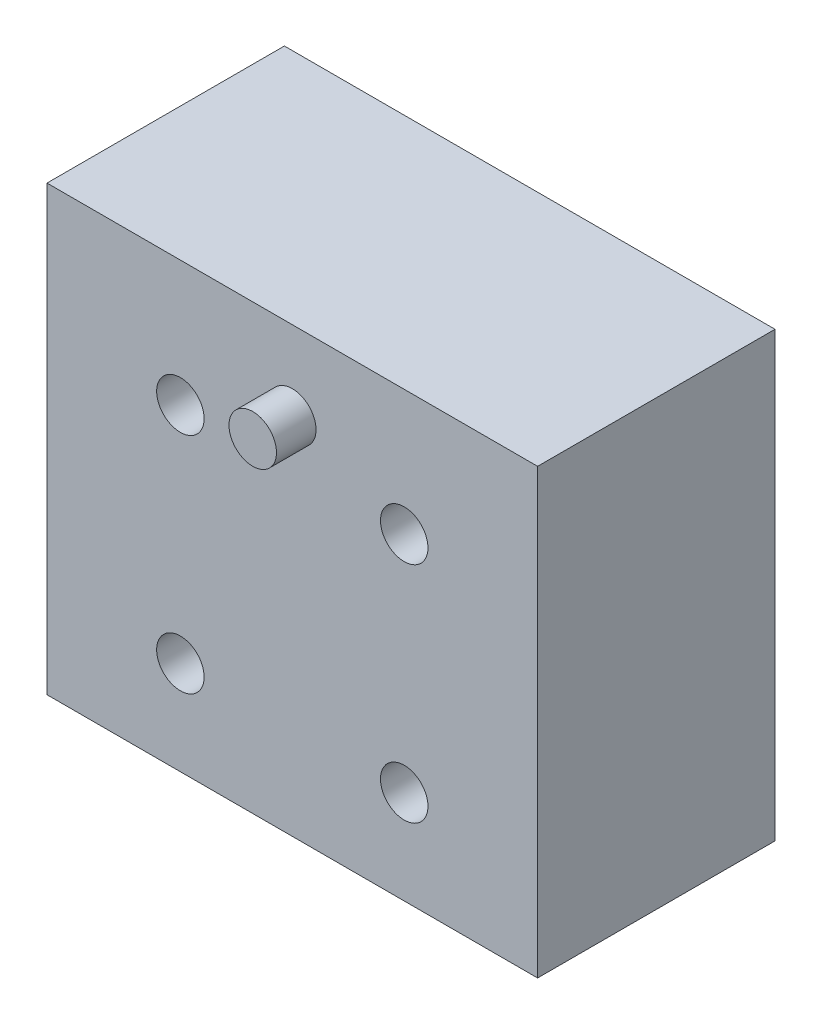
ISO-10303-21;
HEADER;
FILE_DESCRIPTION(('STEP AP214'),'2;1');
FILE_NAME('part.step','',(''),(''),'','','');
FILE_SCHEMA(('AUTOMOTIVE_DESIGN { 1 0 10303 214 1 1 1 1 }'));
ENDSEC;
DATA;
#1=APPLICATION_CONTEXT('core data for automotive mechanical design processes');
#2=APPLICATION_PROTOCOL_DEFINITION('international standard','automotive_design',2000,#1);
#3=PRODUCT_CONTEXT('',#1,'mechanical');
#4=PRODUCT('Part','Part','',(#3));
#5=PRODUCT_RELATED_PRODUCT_CATEGORY('part','',(#4));
#6=PRODUCT_DEFINITION_FORMATION('','',#4);
#7=PRODUCT_DEFINITION_CONTEXT('part definition',#1,'design');
#8=PRODUCT_DEFINITION('design','',#6,#7);
#9=PRODUCT_DEFINITION_SHAPE('','',#8);
#10=(LENGTH_UNIT() NAMED_UNIT(*) SI_UNIT(.MILLI.,.METRE.));
#11=(NAMED_UNIT(*) PLANE_ANGLE_UNIT() SI_UNIT($,.RADIAN.));
#12=(NAMED_UNIT(*) SI_UNIT($,.STERADIAN.) SOLID_ANGLE_UNIT());
#13=UNCERTAINTY_MEASURE_WITH_UNIT(LENGTH_MEASURE(1.E-05),#10,'distance_accuracy_value','');
#14=(GEOMETRIC_REPRESENTATION_CONTEXT(3) GLOBAL_UNCERTAINTY_ASSIGNED_CONTEXT((#13)) GLOBAL_UNIT_ASSIGNED_CONTEXT((#10,
#11,#12)) REPRESENTATION_CONTEXT('',''));
#15=CARTESIAN_POINT('',(0.,0.,0.));
#16=DIRECTION('',(0.,0.,1.));
#17=DIRECTION('',(1.,0.,0.));
#18=AXIS2_PLACEMENT_3D('',#15,#16,#17);
#19=CARTESIAN_POINT('',(-14.142135623731,14.1421356237309,-30.));
#20=DIRECTION('',(0.,0.,1.));
#21=DIRECTION('',(1.,0.,0.));
#22=AXIS2_PLACEMENT_3D('',#19,#20,#21);
#23=CYLINDRICAL_SURFACE('',#22,3.);
#24=CARTESIAN_POINT('',(-14.142135623731,14.1421356237309,0.));
#25=DIRECTION('',(0.,0.,1.));
#26=DIRECTION('',(1.,0.,0.));
#27=AXIS2_PLACEMENT_3D('',#24,#25,#26);
#28=CIRCLE('',#27,3.);
#29=CARTESIAN_POINT('',(-11.142135623731,14.1421356237309,0.));
#30=VERTEX_POINT('',#29);
#31=EDGE_CURVE('E11',#30,#30,#28,.T.);
#32=ORIENTED_EDGE('',*,*,#31,.T.);
#33=EDGE_LOOP('',(#32));
#34=FACE_BOUND('',#33,.T.);
#35=CARTESIAN_POINT('',(-14.142135623731,14.1421356237309,-24.));
#36=DIRECTION('',(0.,0.,-1.));
#37=DIRECTION('',(-1.,0.,0.));
#38=AXIS2_PLACEMENT_3D('',#35,#36,#37);
#39=CIRCLE('',#38,3.);
#40=CARTESIAN_POINT('',(-17.142135623731,14.1421356237309,-24.));
#41=VERTEX_POINT('',#40);
#42=EDGE_CURVE('E41',#41,#41,#39,.F.);
#43=ORIENTED_EDGE('',*,*,#42,.F.);
#44=EDGE_LOOP('',(#43));
#45=FACE_BOUND('',#44,.T.);
#46=ADVANCED_FACE('F37',(#34,#45),#23,.F.);
#47=CARTESIAN_POINT('',(-14.142135623731,-14.1421356237309,-30.));
#48=DIRECTION('',(0.,0.,1.));
#49=DIRECTION('',(1.,0.,0.));
#50=AXIS2_PLACEMENT_3D('',#47,#48,#49);
#51=CYLINDRICAL_SURFACE('',#50,3.);
#52=CARTESIAN_POINT('',(-14.142135623731,-14.1421356237309,0.));
#53=DIRECTION('',(0.,0.,1.));
#54=DIRECTION('',(1.,0.,0.));
#55=AXIS2_PLACEMENT_3D('',#52,#53,#54);
#56=CIRCLE('',#55,3.);
#57=CARTESIAN_POINT('',(-11.142135623731,-14.1421356237309,0.));
#58=VERTEX_POINT('',#57);
#59=EDGE_CURVE('E46',#58,#58,#56,.T.);
#60=ORIENTED_EDGE('',*,*,#59,.T.);
#61=EDGE_LOOP('',(#60));
#62=FACE_BOUND('',#61,.T.);
#63=CARTESIAN_POINT('',(-14.142135623731,-14.1421356237309,-24.));
#64=DIRECTION('',(0.,0.,-1.));
#65=DIRECTION('',(-1.,0.,0.));
#66=AXIS2_PLACEMENT_3D('',#63,#64,#65);
#67=CIRCLE('',#66,3.);
#68=CARTESIAN_POINT('',(-17.142135623731,-14.1421356237309,-24.));
#69=VERTEX_POINT('',#68);
#70=EDGE_CURVE('E113',#69,#69,#67,.F.);
#71=ORIENTED_EDGE('',*,*,#70,.F.);
#72=EDGE_LOOP('',(#71));
#73=FACE_BOUND('',#72,.T.);
#74=ADVANCED_FACE('F206',(#62,#73),#51,.F.);
#75=CARTESIAN_POINT('',(14.142135623731,-14.1421356237309,-30.));
#76=DIRECTION('',(0.,0.,1.));
#77=DIRECTION('',(1.,0.,0.));
#78=AXIS2_PLACEMENT_3D('',#75,#76,#77);
#79=CYLINDRICAL_SURFACE('',#78,3.);
#80=CARTESIAN_POINT('',(14.142135623731,-14.1421356237309,0.));
#81=DIRECTION('',(0.,0.,1.));
#82=DIRECTION('',(1.,0.,0.));
#83=AXIS2_PLACEMENT_3D('',#80,#81,#82);
#84=CIRCLE('',#83,3.);
#85=CARTESIAN_POINT('',(17.142135623731,-14.1421356237309,0.));
#86=VERTEX_POINT('',#85);
#87=EDGE_CURVE('E97',#86,#86,#84,.T.);
#88=ORIENTED_EDGE('',*,*,#87,.T.);
#89=EDGE_LOOP('',(#88));
#90=FACE_BOUND('',#89,.T.);
#91=CARTESIAN_POINT('',(14.142135623731,-14.1421356237309,-24.));
#92=DIRECTION('',(0.,0.,-1.));
#93=DIRECTION('',(-1.,0.,0.));
#94=AXIS2_PLACEMENT_3D('',#91,#92,#93);
#95=CIRCLE('',#94,3.);
#96=CARTESIAN_POINT('',(11.142135623731,-14.1421356237309,-24.));
#97=VERTEX_POINT('',#96);
#98=EDGE_CURVE('E110',#97,#97,#95,.F.);
#99=ORIENTED_EDGE('',*,*,#98,.F.);
#100=EDGE_LOOP('',(#99));
#101=FACE_BOUND('',#100,.T.);
#102=ADVANCED_FACE('F184',(#90,#101),#79,.F.);
#103=CARTESIAN_POINT('',(14.142135623731,14.1421356237309,-30.));
#104=DIRECTION('',(0.,0.,1.));
#105=DIRECTION('',(1.,0.,0.));
#106=AXIS2_PLACEMENT_3D('',#103,#104,#105);
#107=CYLINDRICAL_SURFACE('',#106,3.);
#108=CARTESIAN_POINT('',(14.142135623731,14.1421356237309,0.));
#109=DIRECTION('',(0.,0.,1.));
#110=DIRECTION('',(1.,0.,0.));
#111=AXIS2_PLACEMENT_3D('',#108,#109,#110);
#112=CIRCLE('',#111,3.);
#113=CARTESIAN_POINT('',(17.142135623731,14.1421356237309,0.));
#114=VERTEX_POINT('',#113);
#115=EDGE_CURVE('E94',#114,#114,#112,.T.);
#116=ORIENTED_EDGE('',*,*,#115,.T.);
#117=EDGE_LOOP('',(#116));
#118=FACE_BOUND('',#117,.T.);
#119=CARTESIAN_POINT('',(14.142135623731,14.1421356237309,-24.));
#120=DIRECTION('',(0.,0.,-1.));
#121=DIRECTION('',(-1.,0.,0.));
#122=AXIS2_PLACEMENT_3D('',#119,#120,#121);
#123=CIRCLE('',#122,3.);
#124=CARTESIAN_POINT('',(11.142135623731,14.1421356237309,-24.));
#125=VERTEX_POINT('',#124);
#126=EDGE_CURVE('E107',#125,#125,#123,.F.);
#127=ORIENTED_EDGE('',*,*,#126,.F.);
#128=EDGE_LOOP('',(#127));
#129=FACE_BOUND('',#128,.T.);
#130=ADVANCED_FACE('F39',(#118,#129),#107,.F.);
#131=CARTESIAN_POINT('',(0.,0.,-30.));
#132=DIRECTION('',(0.,0.,1.));
#133=DIRECTION('',(1.,0.,0.));
#134=AXIS2_PLACEMENT_3D('',#131,#132,#133);
#135=PLANE('',#134);
#136=CARTESIAN_POINT('',(14.142135623731,14.1421356237309,-30.));
#137=DIRECTION('',(0.,0.,-1.));
#138=DIRECTION('',(-1.,0.,0.));
#139=AXIS2_PLACEMENT_3D('',#136,#137,#138);
#140=CIRCLE('',#139,4.75);
#141=CARTESIAN_POINT('',(9.39213562373097,14.1421356237309,-30.));
#142=VERTEX_POINT('',#141);
#143=EDGE_CURVE('E265',#142,#142,#140,.T.);
#144=ORIENTED_EDGE('',*,*,#143,.F.);
#145=EDGE_LOOP('',(#144));
#146=FACE_BOUND('',#145,.T.);
#147=CARTESIAN_POINT('',(14.142135623731,-14.1421356237309,-30.));
#148=DIRECTION('',(0.,0.,-1.));
#149=DIRECTION('',(-1.,0.,0.));
#150=AXIS2_PLACEMENT_3D('',#147,#148,#149);
#151=CIRCLE('',#150,4.75);
#152=CARTESIAN_POINT('',(9.39213562373098,-14.1421356237309,-30.));
#153=VERTEX_POINT('',#152);
#154=EDGE_CURVE('E258',#153,#153,#151,.T.);
#155=ORIENTED_EDGE('',*,*,#154,.F.);
#156=EDGE_LOOP('',(#155));
#157=FACE_BOUND('',#156,.T.);
#158=CARTESIAN_POINT('',(-14.142135623731,-14.1421356237309,-30.));
#159=DIRECTION('',(0.,0.,-1.));
#160=DIRECTION('',(-1.,0.,0.));
#161=AXIS2_PLACEMENT_3D('',#158,#159,#160);
#162=CIRCLE('',#161,4.75);
#163=CARTESIAN_POINT('',(-18.892135623731,-14.1421356237309,-30.));
#164=VERTEX_POINT('',#163);
#165=EDGE_CURVE('E253',#164,#164,#162,.T.);
#166=ORIENTED_EDGE('',*,*,#165,.F.);
#167=EDGE_LOOP('',(#166));
#168=FACE_BOUND('',#167,.T.);
#169=CARTESIAN_POINT('',(-14.142135623731,14.1421356237309,-30.));
#170=DIRECTION('',(0.,0.,-1.));
#171=DIRECTION('',(-1.,0.,0.));
#172=AXIS2_PLACEMENT_3D('',#169,#170,#171);
#173=CIRCLE('',#172,4.75);
#174=CARTESIAN_POINT('',(-18.892135623731,14.1421356237309,-30.));
#175=VERTEX_POINT('',#174);
#176=EDGE_CURVE('E255',#175,#175,#173,.T.);
#177=ORIENTED_EDGE('',*,*,#176,.F.);
#178=EDGE_LOOP('',(#177));
#179=FACE_BOUND('',#178,.T.);
#180=DIRECTION('',(0.,-1.,0.));
#181=VECTOR('',#180,1.);
#182=CARTESIAN_POINT('',(31.,0.,-30.));
#183=LINE('',#182,#181);
#184=CARTESIAN_POINT('',(31.,30.,-30.));
#185=VERTEX_POINT('',#184);
#186=CARTESIAN_POINT('',(31.,-26.,-30.));
#187=VERTEX_POINT('',#186);
#188=EDGE_CURVE('E82',#185,#187,#183,.T.);
#189=ORIENTED_EDGE('',*,*,#188,.T.);
#190=DIRECTION('',(-1.,0.,0.));
#191=VECTOR('',#190,1.);
#192=CARTESIAN_POINT('',(-31.,-26.,-30.));
#193=LINE('',#192,#191);
#194=CARTESIAN_POINT('',(-31.,-26.,-30.));
#195=VERTEX_POINT('',#194);
#196=EDGE_CURVE('E54',#187,#195,#193,.T.);
#197=ORIENTED_EDGE('',*,*,#196,.T.);
#198=DIRECTION('',(0.,1.,0.));
#199=VECTOR('',#198,1.);
#200=CARTESIAN_POINT('',(-31.,0.,-30.));
#201=LINE('',#200,#199);
#202=CARTESIAN_POINT('',(-31.,30.,-30.));
#203=VERTEX_POINT('',#202);
#204=EDGE_CURVE('E77',#195,#203,#201,.T.);
#205=ORIENTED_EDGE('',*,*,#204,.T.);
#206=DIRECTION('',(1.,0.,0.));
#207=VECTOR('',#206,1.);
#208=CARTESIAN_POINT('',(0.,30.,-30.));
#209=LINE('',#208,#207);
#210=EDGE_CURVE('E81',#203,#185,#209,.T.);
#211=ORIENTED_EDGE('',*,*,#210,.T.);
#212=EDGE_LOOP('',(#189,#197,#205,#211));
#213=FACE_BOUND('',#212,.T.);
#214=ADVANCED_FACE('F80',(#146,#157,#168,#179,#213),#135,.F.);
#215=CARTESIAN_POINT('',(0.,0.,0.));
#216=DIRECTION('',(0.,0.,1.));
#217=DIRECTION('',(1.,0.,0.));
#218=AXIS2_PLACEMENT_3D('',#215,#216,#217);
#219=PLANE('',#218);
#220=CARTESIAN_POINT('',(0.,20.,0.));
#221=DIRECTION('',(0.,0.,1.));
#222=DIRECTION('',(1.,0.,0.));
#223=AXIS2_PLACEMENT_3D('',#220,#221,#222);
#224=CIRCLE('',#223,3.);
#225=CARTESIAN_POINT('',(3.,20.,0.));
#226=VERTEX_POINT('',#225);
#227=EDGE_CURVE('E118',#226,#226,#224,.T.);
#228=ORIENTED_EDGE('',*,*,#227,.F.);
#229=EDGE_LOOP('',(#228));
#230=FACE_BOUND('',#229,.T.);
#231=DIRECTION('',(-1.,0.,0.));
#232=VECTOR('',#231,1.);
#233=CARTESIAN_POINT('',(-31.,-26.,0.));
#234=LINE('',#233,#232);
#235=CARTESIAN_POINT('',(31.,-26.,0.));
#236=VERTEX_POINT('',#235);
#237=CARTESIAN_POINT('',(-31.,-26.,0.));
#238=VERTEX_POINT('',#237);
#239=EDGE_CURVE('E134',#236,#238,#234,.T.);
#240=ORIENTED_EDGE('',*,*,#239,.F.);
#241=DIRECTION('',(0.,-1.,0.));
#242=VECTOR('',#241,1.);
#243=CARTESIAN_POINT('',(31.,0.,0.));
#244=LINE('',#243,#242);
#245=CARTESIAN_POINT('',(31.,30.,0.));
#246=VERTEX_POINT('',#245);
#247=EDGE_CURVE('E156',#246,#236,#244,.T.);
#248=ORIENTED_EDGE('',*,*,#247,.F.);
#249=DIRECTION('',(1.,0.,0.));
#250=VECTOR('',#249,1.);
#251=CARTESIAN_POINT('',(0.,30.,0.));
#252=LINE('',#251,#250);
#253=CARTESIAN_POINT('',(-31.,30.,0.));
#254=VERTEX_POINT('',#253);
#255=EDGE_CURVE('E99',#254,#246,#252,.T.);
#256=ORIENTED_EDGE('',*,*,#255,.F.);
#257=DIRECTION('',(0.,1.,0.));
#258=VECTOR('',#257,1.);
#259=CARTESIAN_POINT('',(-31.,0.,0.));
#260=LINE('',#259,#258);
#261=EDGE_CURVE('E63',#238,#254,#260,.T.);
#262=ORIENTED_EDGE('',*,*,#261,.F.);
#263=EDGE_LOOP('',(#240,#248,#256,#262));
#264=FACE_BOUND('',#263,.T.);
#265=ORIENTED_EDGE('',*,*,#59,.F.);
#266=EDGE_LOOP('',(#265));
#267=FACE_BOUND('',#266,.T.);
#268=ORIENTED_EDGE('',*,*,#87,.F.);
#269=EDGE_LOOP('',(#268));
#270=FACE_BOUND('',#269,.T.);
#271=ORIENTED_EDGE('',*,*,#31,.F.);
#272=EDGE_LOOP('',(#271));
#273=FACE_BOUND('',#272,.T.);
#274=ORIENTED_EDGE('',*,*,#115,.F.);
#275=EDGE_LOOP('',(#274));
#276=FACE_BOUND('',#275,.T.);
#277=ADVANCED_FACE('F168',(#230,#264,#267,#270,#273,#276),#219,.T.);
#278=CARTESIAN_POINT('',(-31.,0.,0.));
#279=DIRECTION('',(-1.,0.,0.));
#280=DIRECTION('',(0.,0.,1.));
#281=AXIS2_PLACEMENT_3D('',#278,#279,#280);
#282=PLANE('',#281);
#283=DIRECTION('',(0.,0.,1.));
#284=VECTOR('',#283,1.);
#285=CARTESIAN_POINT('',(-31.,-26.,-30.));
#286=LINE('',#285,#284);
#287=EDGE_CURVE('E83',#195,#238,#286,.T.);
#288=ORIENTED_EDGE('',*,*,#287,.T.);
#289=ORIENTED_EDGE('',*,*,#261,.T.);
#290=DIRECTION('',(0.,0.,-1.));
#291=VECTOR('',#290,1.);
#292=CARTESIAN_POINT('',(-31.,30.,0.));
#293=LINE('',#292,#291);
#294=EDGE_CURVE('E87',#254,#203,#293,.T.);
#295=ORIENTED_EDGE('',*,*,#294,.T.);
#296=ORIENTED_EDGE('',*,*,#204,.F.);
#297=EDGE_LOOP('',(#288,#289,#295,#296));
#298=FACE_BOUND('',#297,.T.);
#299=ADVANCED_FACE('F93',(#298),#282,.T.);
#300=CARTESIAN_POINT('',(0.,30.,0.));
#301=DIRECTION('',(0.,1.,0.));
#302=DIRECTION('',(-1.,0.,0.));
#303=AXIS2_PLACEMENT_3D('',#300,#301,#302);
#304=PLANE('',#303);
#305=ORIENTED_EDGE('',*,*,#210,.F.);
#306=ORIENTED_EDGE('',*,*,#294,.F.);
#307=ORIENTED_EDGE('',*,*,#255,.T.);
#308=DIRECTION('',(0.,0.,-1.));
#309=VECTOR('',#308,1.);
#310=CARTESIAN_POINT('',(31.,30.,0.));
#311=LINE('',#310,#309);
#312=EDGE_CURVE('E90',#246,#185,#311,.T.);
#313=ORIENTED_EDGE('',*,*,#312,.T.);
#314=EDGE_LOOP('',(#305,#306,#307,#313));
#315=FACE_BOUND('',#314,.T.);
#316=ADVANCED_FACE('F86',(#315),#304,.T.);
#317=CARTESIAN_POINT('',(31.,0.,0.));
#318=DIRECTION('',(1.,0.,0.));
#319=DIRECTION('',(0.,1.,0.));
#320=AXIS2_PLACEMENT_3D('',#317,#318,#319);
#321=PLANE('',#320);
#322=DIRECTION('',(0.,0.,1.));
#323=VECTOR('',#322,1.);
#324=CARTESIAN_POINT('',(31.,-26.,-30.));
#325=LINE('',#324,#323);
#326=EDGE_CURVE('E150',#187,#236,#325,.T.);
#327=ORIENTED_EDGE('',*,*,#326,.F.);
#328=ORIENTED_EDGE('',*,*,#188,.F.);
#329=ORIENTED_EDGE('',*,*,#312,.F.);
#330=ORIENTED_EDGE('',*,*,#247,.T.);
#331=EDGE_LOOP('',(#327,#328,#329,#330));
#332=FACE_BOUND('',#331,.T.);
#333=ADVANCED_FACE('F160',(#332),#321,.T.);
#334=CARTESIAN_POINT('',(-31.,-26.,-30.));
#335=DIRECTION('',(0.,1.,0.));
#336=DIRECTION('',(0.,0.,1.));
#337=AXIS2_PLACEMENT_3D('',#334,#335,#336);
#338=PLANE('',#337);
#339=CARTESIAN_POINT('',(24.07,-26.,-15.));
#340=DIRECTION('',(0.,-1.,0.));
#341=DIRECTION('',(0.,0.,-1.));
#342=AXIS2_PLACEMENT_3D('',#339,#340,#341);
#343=CIRCLE('',#342,2.5);
#344=CARTESIAN_POINT('',(24.07,-26.,-17.5));
#345=VERTEX_POINT('',#344);
#346=EDGE_CURVE('E135',#345,#345,#343,.T.);
#347=ORIENTED_EDGE('',*,*,#346,.F.);
#348=EDGE_LOOP('',(#347));
#349=FACE_BOUND('',#348,.T.);
#350=CARTESIAN_POINT('',(0.,-26.,-15.));
#351=DIRECTION('',(0.,-1.,0.));
#352=DIRECTION('',(0.,0.,-1.));
#353=AXIS2_PLACEMENT_3D('',#350,#351,#352);
#354=CIRCLE('',#353,2.5);
#355=CARTESIAN_POINT('',(0.,-26.,-17.5));
#356=VERTEX_POINT('',#355);
#357=EDGE_CURVE('E141',#356,#356,#354,.T.);
#358=ORIENTED_EDGE('',*,*,#357,.F.);
#359=EDGE_LOOP('',(#358));
#360=FACE_BOUND('',#359,.T.);
#361=CARTESIAN_POINT('',(-24.07,-26.,-15.));
#362=DIRECTION('',(0.,-1.,0.));
#363=DIRECTION('',(0.,0.,-1.));
#364=AXIS2_PLACEMENT_3D('',#361,#362,#363);
#365=CIRCLE('',#364,2.5);
#366=CARTESIAN_POINT('',(-24.07,-26.,-17.5));
#367=VERTEX_POINT('',#366);
#368=EDGE_CURVE('E127',#367,#367,#365,.T.);
#369=ORIENTED_EDGE('',*,*,#368,.F.);
#370=EDGE_LOOP('',(#369));
#371=FACE_BOUND('',#370,.T.);
#372=ORIENTED_EDGE('',*,*,#239,.T.);
#373=ORIENTED_EDGE('',*,*,#287,.F.);
#374=ORIENTED_EDGE('',*,*,#196,.F.);
#375=ORIENTED_EDGE('',*,*,#326,.T.);
#376=EDGE_LOOP('',(#372,#373,#374,#375));
#377=FACE_BOUND('',#376,.T.);
#378=ADVANCED_FACE('F164',(#349,#360,#371,#377),#338,.F.);
#379=CARTESIAN_POINT('',(-24.07,-11.,-15.));
#380=DIRECTION('',(0.,-1.,0.));
#381=DIRECTION('',(0.,0.,-1.));
#382=AXIS2_PLACEMENT_3D('',#379,#380,#381);
#383=CYLINDRICAL_SURFACE('',#382,2.5);
#384=CARTESIAN_POINT('',(-24.07,-11.,-15.));
#385=DIRECTION('',(0.,-1.,0.));
#386=DIRECTION('',(0.,0.,-1.));
#387=AXIS2_PLACEMENT_3D('',#384,#385,#386);
#388=CIRCLE('',#387,2.5);
#389=CARTESIAN_POINT('',(-24.07,-11.,-17.5));
#390=VERTEX_POINT('',#389);
#391=EDGE_CURVE('E144',#390,#390,#388,.T.);
#392=ORIENTED_EDGE('',*,*,#391,.F.);
#393=EDGE_LOOP('',(#392));
#394=FACE_BOUND('',#393,.T.);
#395=ORIENTED_EDGE('',*,*,#368,.T.);
#396=EDGE_LOOP('',(#395));
#397=FACE_BOUND('',#396,.T.);
#398=ADVANCED_FACE('F293',(#394,#397),#383,.F.);
#399=CARTESIAN_POINT('',(-24.07,-11.,-15.));
#400=DIRECTION('',(0.,-1.,0.));
#401=DIRECTION('',(0.,0.,-1.));
#402=AXIS2_PLACEMENT_3D('',#399,#400,#401);
#403=PLANE('',#402);
#404=ORIENTED_EDGE('',*,*,#391,.T.);
#405=EDGE_LOOP('',(#404));
#406=FACE_BOUND('',#405,.T.);
#407=ADVANCED_FACE('F297',(#406),#403,.T.);
#408=CARTESIAN_POINT('',(0.,-11.,-15.));
#409=DIRECTION('',(0.,-1.,0.));
#410=DIRECTION('',(0.,0.,-1.));
#411=AXIS2_PLACEMENT_3D('',#408,#409,#410);
#412=CYLINDRICAL_SURFACE('',#411,2.5);
#413=CARTESIAN_POINT('',(0.,-11.,-15.));
#414=DIRECTION('',(0.,-1.,0.));
#415=DIRECTION('',(0.,0.,-1.));
#416=AXIS2_PLACEMENT_3D('',#413,#414,#415);
#417=CIRCLE('',#416,2.5);
#418=CARTESIAN_POINT('',(0.,-11.,-17.5));
#419=VERTEX_POINT('',#418);
#420=EDGE_CURVE('E138',#419,#419,#417,.T.);
#421=ORIENTED_EDGE('',*,*,#420,.F.);
#422=EDGE_LOOP('',(#421));
#423=FACE_BOUND('',#422,.T.);
#424=ORIENTED_EDGE('',*,*,#357,.T.);
#425=EDGE_LOOP('',(#424));
#426=FACE_BOUND('',#425,.T.);
#427=ADVANCED_FACE('F301',(#423,#426),#412,.F.);
#428=CARTESIAN_POINT('',(0.,-11.,-15.));
#429=DIRECTION('',(0.,-1.,0.));
#430=DIRECTION('',(0.,0.,-1.));
#431=AXIS2_PLACEMENT_3D('',#428,#429,#430);
#432=PLANE('',#431);
#433=ORIENTED_EDGE('',*,*,#420,.T.);
#434=EDGE_LOOP('',(#433));
#435=FACE_BOUND('',#434,.T.);
#436=ADVANCED_FACE('F305',(#435),#432,.T.);
#437=CARTESIAN_POINT('',(24.07,-11.,-15.));
#438=DIRECTION('',(0.,-1.,0.));
#439=DIRECTION('',(0.,0.,-1.));
#440=AXIS2_PLACEMENT_3D('',#437,#438,#439);
#441=CYLINDRICAL_SURFACE('',#440,2.5);
#442=CARTESIAN_POINT('',(24.07,-11.,-15.));
#443=DIRECTION('',(0.,-1.,0.));
#444=DIRECTION('',(0.,0.,-1.));
#445=AXIS2_PLACEMENT_3D('',#442,#443,#444);
#446=CIRCLE('',#445,2.5);
#447=CARTESIAN_POINT('',(24.07,-11.,-17.5));
#448=VERTEX_POINT('',#447);
#449=EDGE_CURVE('E131',#448,#448,#446,.T.);
#450=ORIENTED_EDGE('',*,*,#449,.F.);
#451=EDGE_LOOP('',(#450));
#452=FACE_BOUND('',#451,.T.);
#453=ORIENTED_EDGE('',*,*,#346,.T.);
#454=EDGE_LOOP('',(#453));
#455=FACE_BOUND('',#454,.T.);
#456=ADVANCED_FACE('F309',(#452,#455),#441,.F.);
#457=CARTESIAN_POINT('',(24.07,-11.,-15.));
#458=DIRECTION('',(0.,-1.,0.));
#459=DIRECTION('',(0.,0.,-1.));
#460=AXIS2_PLACEMENT_3D('',#457,#458,#459);
#461=PLANE('',#460);
#462=ORIENTED_EDGE('',*,*,#449,.T.);
#463=EDGE_LOOP('',(#462));
#464=FACE_BOUND('',#463,.T.);
#465=ADVANCED_FACE('F313',(#464),#461,.T.);
#466=CARTESIAN_POINT('',(0.,20.,5.));
#467=DIRECTION('',(0.,0.,-1.));
#468=DIRECTION('',(-1.,0.,0.));
#469=AXIS2_PLACEMENT_3D('',#466,#467,#468);
#470=CYLINDRICAL_SURFACE('',#469,3.);
#471=CARTESIAN_POINT('',(0.,20.,5.));
#472=DIRECTION('',(0.,0.,1.));
#473=DIRECTION('',(1.,0.,0.));
#474=AXIS2_PLACEMENT_3D('',#471,#472,#473);
#475=CIRCLE('',#474,3.);
#476=CARTESIAN_POINT('',(3.,20.,5.));
#477=VERTEX_POINT('',#476);
#478=EDGE_CURVE('E122',#477,#477,#475,.T.);
#479=ORIENTED_EDGE('',*,*,#478,.F.);
#480=EDGE_LOOP('',(#479));
#481=FACE_BOUND('',#480,.T.);
#482=ORIENTED_EDGE('',*,*,#227,.T.);
#483=EDGE_LOOP('',(#482));
#484=FACE_BOUND('',#483,.T.);
#485=ADVANCED_FACE('F200',(#481,#484),#470,.T.);
#486=CARTESIAN_POINT('',(0.,20.,5.));
#487=DIRECTION('',(0.,0.,1.));
#488=DIRECTION('',(1.,0.,0.));
#489=AXIS2_PLACEMENT_3D('',#486,#487,#488);
#490=PLANE('',#489);
#491=ORIENTED_EDGE('',*,*,#478,.T.);
#492=EDGE_LOOP('',(#491));
#493=FACE_BOUND('',#492,.T.);
#494=ADVANCED_FACE('F190',(#493),#490,.T.);
#495=CARTESIAN_POINT('',(14.142135623731,14.1421356237309,-24.));
#496=DIRECTION('',(0.,0.,-1.));
#497=DIRECTION('',(-1.,0.,0.));
#498=AXIS2_PLACEMENT_3D('',#495,#496,#497);
#499=PLANE('',#498);
#500=CARTESIAN_POINT('',(14.142135623731,14.1421356237309,-24.));
#501=DIRECTION('',(0.,0.,-1.));
#502=DIRECTION('',(-1.,0.,0.));
#503=AXIS2_PLACEMENT_3D('',#500,#501,#502);
#504=CIRCLE('',#503,4.75);
#505=CARTESIAN_POINT('',(9.39213562373097,14.1421356237309,-24.));
#506=VERTEX_POINT('',#505);
#507=EDGE_CURVE('E268',#506,#506,#504,.T.);
#508=ORIENTED_EDGE('',*,*,#507,.T.);
#509=EDGE_LOOP('',(#508));
#510=FACE_BOUND('',#509,.T.);
#511=ORIENTED_EDGE('',*,*,#126,.T.);
#512=EDGE_LOOP('',(#511));
#513=FACE_BOUND('',#512,.T.);
#514=ADVANCED_FACE('F187',(#510,#513),#499,.T.);
#515=CARTESIAN_POINT('',(14.142135623731,14.1421356237309,-24.));
#516=DIRECTION('',(0.,0.,-1.));
#517=DIRECTION('',(-1.,0.,0.));
#518=AXIS2_PLACEMENT_3D('',#515,#516,#517);
#519=CYLINDRICAL_SURFACE('',#518,4.75);
#520=ORIENTED_EDGE('',*,*,#507,.F.);
#521=EDGE_LOOP('',(#520));
#522=FACE_BOUND('',#521,.T.);
#523=ORIENTED_EDGE('',*,*,#143,.T.);
#524=EDGE_LOOP('',(#523));
#525=FACE_BOUND('',#524,.T.);
#526=ADVANCED_FACE('F189',(#522,#525),#519,.F.);
#527=CARTESIAN_POINT('',(14.142135623731,-14.1421356237309,-24.));
#528=DIRECTION('',(0.,0.,-1.));
#529=DIRECTION('',(-1.,0.,0.));
#530=AXIS2_PLACEMENT_3D('',#527,#528,#529);
#531=PLANE('',#530);
#532=CARTESIAN_POINT('',(14.142135623731,-14.1421356237309,-24.));
#533=DIRECTION('',(0.,0.,-1.));
#534=DIRECTION('',(-1.,0.,0.));
#535=AXIS2_PLACEMENT_3D('',#532,#533,#534);
#536=CIRCLE('',#535,4.75);
#537=CARTESIAN_POINT('',(9.39213562373098,-14.1421356237309,-24.));
#538=VERTEX_POINT('',#537);
#539=EDGE_CURVE('E263',#538,#538,#536,.T.);
#540=ORIENTED_EDGE('',*,*,#539,.T.);
#541=EDGE_LOOP('',(#540));
#542=FACE_BOUND('',#541,.T.);
#543=ORIENTED_EDGE('',*,*,#98,.T.);
#544=EDGE_LOOP('',(#543));
#545=FACE_BOUND('',#544,.T.);
#546=ADVANCED_FACE('F197',(#542,#545),#531,.T.);
#547=CARTESIAN_POINT('',(14.142135623731,-14.1421356237309,-24.));
#548=DIRECTION('',(0.,0.,-1.));
#549=DIRECTION('',(-1.,0.,0.));
#550=AXIS2_PLACEMENT_3D('',#547,#548,#549);
#551=CYLINDRICAL_SURFACE('',#550,4.75);
#552=ORIENTED_EDGE('',*,*,#539,.F.);
#553=EDGE_LOOP('',(#552));
#554=FACE_BOUND('',#553,.T.);
#555=ORIENTED_EDGE('',*,*,#154,.T.);
#556=EDGE_LOOP('',(#555));
#557=FACE_BOUND('',#556,.T.);
#558=ADVANCED_FACE('F224',(#554,#557),#551,.F.);
#559=CARTESIAN_POINT('',(-14.142135623731,-14.1421356237309,-24.));
#560=DIRECTION('',(0.,0.,-1.));
#561=DIRECTION('',(-1.,0.,0.));
#562=AXIS2_PLACEMENT_3D('',#559,#560,#561);
#563=PLANE('',#562);
#564=CARTESIAN_POINT('',(-14.142135623731,-14.1421356237309,-24.));
#565=DIRECTION('',(0.,0.,-1.));
#566=DIRECTION('',(-1.,0.,0.));
#567=AXIS2_PLACEMENT_3D('',#564,#565,#566);
#568=CIRCLE('',#567,4.75);
#569=CARTESIAN_POINT('',(-18.892135623731,-14.1421356237309,-24.));
#570=VERTEX_POINT('',#569);
#571=EDGE_CURVE('E250',#570,#570,#568,.T.);
#572=ORIENTED_EDGE('',*,*,#571,.T.);
#573=EDGE_LOOP('',(#572));
#574=FACE_BOUND('',#573,.T.);
#575=ORIENTED_EDGE('',*,*,#70,.T.);
#576=EDGE_LOOP('',(#575));
#577=FACE_BOUND('',#576,.T.);
#578=ADVANCED_FACE('F230',(#574,#577),#563,.T.);
#579=CARTESIAN_POINT('',(-14.142135623731,-14.1421356237309,-24.));
#580=DIRECTION('',(0.,0.,-1.));
#581=DIRECTION('',(-1.,0.,0.));
#582=AXIS2_PLACEMENT_3D('',#579,#580,#581);
#583=CYLINDRICAL_SURFACE('',#582,4.75);
#584=ORIENTED_EDGE('',*,*,#571,.F.);
#585=EDGE_LOOP('',(#584));
#586=FACE_BOUND('',#585,.T.);
#587=ORIENTED_EDGE('',*,*,#165,.T.);
#588=EDGE_LOOP('',(#587));
#589=FACE_BOUND('',#588,.T.);
#590=ADVANCED_FACE('F237',(#586,#589),#583,.F.);
#591=CARTESIAN_POINT('',(-14.142135623731,14.1421356237309,-24.));
#592=DIRECTION('',(0.,0.,-1.));
#593=DIRECTION('',(-1.,0.,0.));
#594=AXIS2_PLACEMENT_3D('',#591,#592,#593);
#595=PLANE('',#594);
#596=CARTESIAN_POINT('',(-14.142135623731,14.1421356237309,-24.));
#597=DIRECTION('',(0.,0.,-1.));
#598=DIRECTION('',(-1.,0.,0.));
#599=AXIS2_PLACEMENT_3D('',#596,#597,#598);
#600=CIRCLE('',#599,4.75);
#601=CARTESIAN_POINT('',(-18.892135623731,14.1421356237309,-24.));
#602=VERTEX_POINT('',#601);
#603=EDGE_CURVE('E111',#602,#602,#600,.T.);
#604=ORIENTED_EDGE('',*,*,#603,.T.);
#605=EDGE_LOOP('',(#604));
#606=FACE_BOUND('',#605,.T.);
#607=ORIENTED_EDGE('',*,*,#42,.T.);
#608=EDGE_LOOP('',(#607));
#609=FACE_BOUND('',#608,.T.);
#610=ADVANCED_FACE('F240',(#606,#609),#595,.T.);
#611=CARTESIAN_POINT('',(-14.142135623731,14.1421356237309,-24.));
#612=DIRECTION('',(0.,0.,-1.));
#613=DIRECTION('',(-1.,0.,0.));
#614=AXIS2_PLACEMENT_3D('',#611,#612,#613);
#615=CYLINDRICAL_SURFACE('',#614,4.75);
#616=ORIENTED_EDGE('',*,*,#603,.F.);
#617=EDGE_LOOP('',(#616));
#618=FACE_BOUND('',#617,.T.);
#619=ORIENTED_EDGE('',*,*,#176,.T.);
#620=EDGE_LOOP('',(#619));
#621=FACE_BOUND('',#620,.T.);
#622=ADVANCED_FACE('F245',(#618,#621),#615,.F.);
#623=CLOSED_SHELL('',(#46,#74,#102,#130,#214,#277,#299,#316,#333,#378,#398,#407,#427,#436,#456,
#465,#485,#494,#514,#526,#546,#558,#578,#590,#610,#622));
#624=MANIFOLD_SOLID_BREP('B2',#623);
#625=ADVANCED_BREP_SHAPE_REPRESENTATION('',(#18,#624),#14);
#626=SHAPE_DEFINITION_REPRESENTATION(#9,#625);
ENDSEC;
END-ISO-10303-21;
